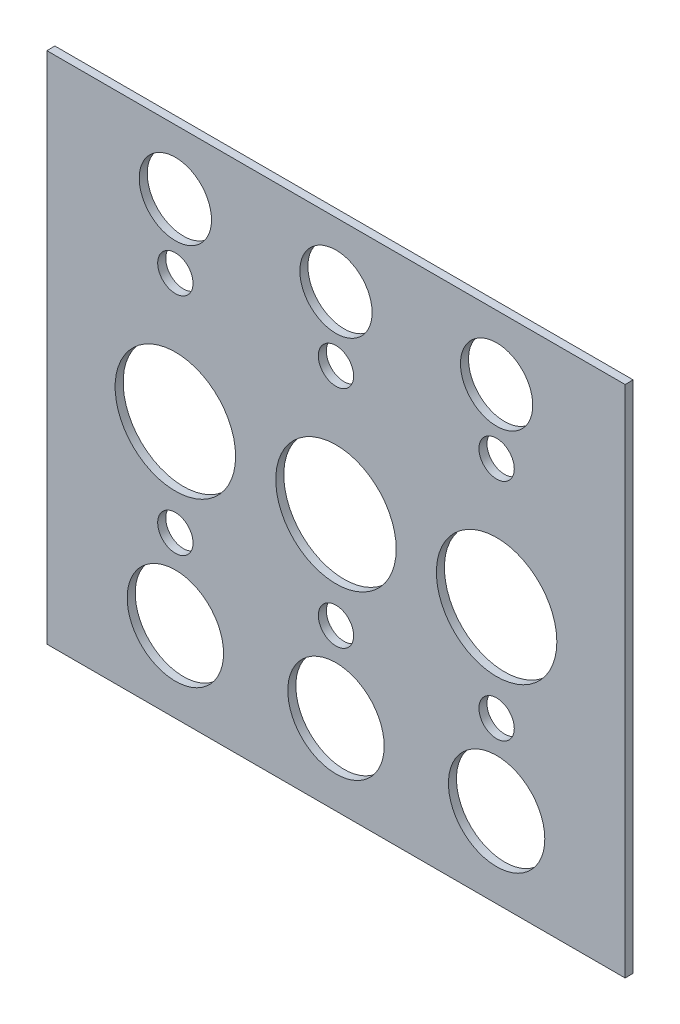
ISO-10303-21;
HEADER;
FILE_DESCRIPTION(('STEP AP214'),'2;1');
FILE_NAME('part.step','',(''),(''),'','','');
FILE_SCHEMA(('AUTOMOTIVE_DESIGN { 1 0 10303 214 1 1 1 1 }'));
ENDSEC;
DATA;
#1=APPLICATION_CONTEXT('core data for automotive mechanical design processes');
#2=APPLICATION_PROTOCOL_DEFINITION('international standard','automotive_design',2000,#1);
#3=PRODUCT_CONTEXT('',#1,'mechanical');
#4=PRODUCT('Part','Part','',(#3));
#5=PRODUCT_RELATED_PRODUCT_CATEGORY('part','',(#4));
#6=PRODUCT_DEFINITION_FORMATION('','',#4);
#7=PRODUCT_DEFINITION_CONTEXT('part definition',#1,'design');
#8=PRODUCT_DEFINITION('design','',#6,#7);
#9=PRODUCT_DEFINITION_SHAPE('','',#8);
#10=(LENGTH_UNIT() NAMED_UNIT(*) SI_UNIT(.MILLI.,.METRE.));
#11=(NAMED_UNIT(*) PLANE_ANGLE_UNIT() SI_UNIT($,.RADIAN.));
#12=(NAMED_UNIT(*) SI_UNIT($,.STERADIAN.) SOLID_ANGLE_UNIT());
#13=UNCERTAINTY_MEASURE_WITH_UNIT(LENGTH_MEASURE(1.E-05),#10,'distance_accuracy_value','');
#14=(GEOMETRIC_REPRESENTATION_CONTEXT(3) GLOBAL_UNCERTAINTY_ASSIGNED_CONTEXT((#13)) GLOBAL_UNIT_ASSIGNED_CONTEXT((#10,
#11,#12)) REPRESENTATION_CONTEXT('',''));
#15=CARTESIAN_POINT('',(0.,0.,0.));
#16=DIRECTION('',(0.,0.,1.));
#17=DIRECTION('',(1.,0.,0.));
#18=AXIS2_PLACEMENT_3D('',#15,#16,#17);
#19=CARTESIAN_POINT('',(0.,0.,5.));
#20=DIRECTION('',(0.,0.,1.));
#21=DIRECTION('',(1.,0.,0.));
#22=AXIS2_PLACEMENT_3D('',#19,#20,#21);
#23=PLANE('',#22);
#24=CARTESIAN_POINT('',(0.,120.,5.));
#25=DIRECTION('',(0.,0.,1.));
#26=DIRECTION('',(1.,0.,0.));
#27=AXIS2_PLACEMENT_3D('',#24,#25,#26);
#28=CIRCLE('',#27,22.5);
#29=CARTESIAN_POINT('',(22.5,120.,5.));
#30=VERTEX_POINT('',#29);
#31=EDGE_CURVE('E188',#30,#30,#28,.T.);
#32=ORIENTED_EDGE('',*,*,#31,.F.);
#33=EDGE_LOOP('',(#32));
#34=FACE_BOUND('',#33,.T.);
#35=CARTESIAN_POINT('',(-99.9999999999999,-110.,5.));
#36=DIRECTION('',(0.,0.,1.));
#37=DIRECTION('',(1.,0.,0.));
#38=AXIS2_PLACEMENT_3D('',#35,#36,#37);
#39=CIRCLE('',#38,30.);
#40=CARTESIAN_POINT('',(-70.,-110.,5.));
#41=VERTEX_POINT('',#40);
#42=EDGE_CURVE('E176',#41,#41,#39,.T.);
#43=ORIENTED_EDGE('',*,*,#42,.F.);
#44=EDGE_LOOP('',(#43));
#45=FACE_BOUND('',#44,.T.);
#46=CARTESIAN_POINT('',(100.,-110.,5.));
#47=DIRECTION('',(0.,0.,1.));
#48=DIRECTION('',(1.,0.,0.));
#49=AXIS2_PLACEMENT_3D('',#46,#47,#48);
#50=CIRCLE('',#49,30.);
#51=CARTESIAN_POINT('',(130.,-110.,5.));
#52=VERTEX_POINT('',#51);
#53=EDGE_CURVE('E164',#52,#52,#50,.T.);
#54=ORIENTED_EDGE('',*,*,#53,.F.);
#55=EDGE_LOOP('',(#54));
#56=FACE_BOUND('',#55,.T.);
#57=CARTESIAN_POINT('',(0.,0.,5.));
#58=DIRECTION('',(0.,0.,1.));
#59=DIRECTION('',(1.,0.,0.));
#60=AXIS2_PLACEMENT_3D('',#57,#58,#59);
#61=CIRCLE('',#60,37.5);
#62=CARTESIAN_POINT('',(37.5,0.,5.));
#63=VERTEX_POINT('',#62);
#64=EDGE_CURVE('E152',#63,#63,#61,.T.);
#65=ORIENTED_EDGE('',*,*,#64,.F.);
#66=EDGE_LOOP('',(#65));
#67=FACE_BOUND('',#66,.T.);
#68=CARTESIAN_POINT('',(-99.9999999999999,-60.,5.));
#69=DIRECTION('',(0.,0.,1.));
#70=DIRECTION('',(1.,0.,0.));
#71=AXIS2_PLACEMENT_3D('',#68,#69,#70);
#72=CIRCLE('',#71,11.);
#73=CARTESIAN_POINT('',(-89.,-60.,5.));
#74=VERTEX_POINT('',#73);
#75=EDGE_CURVE('E140',#74,#74,#72,.T.);
#76=ORIENTED_EDGE('',*,*,#75,.F.);
#77=EDGE_LOOP('',(#76));
#78=FACE_BOUND('',#77,.T.);
#79=CARTESIAN_POINT('',(0.,-60.,5.));
#80=DIRECTION('',(0.,0.,1.));
#81=DIRECTION('',(1.,0.,0.));
#82=AXIS2_PLACEMENT_3D('',#79,#80,#81);
#83=CIRCLE('',#82,11.);
#84=CARTESIAN_POINT('',(11.0000000000001,-60.,5.));
#85=VERTEX_POINT('',#84);
#86=EDGE_CURVE('E128',#85,#85,#83,.T.);
#87=ORIENTED_EDGE('',*,*,#86,.F.);
#88=EDGE_LOOP('',(#87));
#89=FACE_BOUND('',#88,.T.);
#90=CARTESIAN_POINT('',(100.,80.,5.));
#91=DIRECTION('',(0.,0.,1.));
#92=DIRECTION('',(1.,0.,0.));
#93=AXIS2_PLACEMENT_3D('',#90,#91,#92);
#94=CIRCLE('',#93,11.);
#95=CARTESIAN_POINT('',(111.,80.,5.));
#96=VERTEX_POINT('',#95);
#97=EDGE_CURVE('E116',#96,#96,#94,.T.);
#98=ORIENTED_EDGE('',*,*,#97,.F.);
#99=EDGE_LOOP('',(#98));
#100=FACE_BOUND('',#99,.T.);
#101=DIRECTION('',(0.,1.,0.));
#102=VECTOR('',#101,1.);
#103=CARTESIAN_POINT('',(180.,160.,5.));
#104=LINE('',#103,#102);
#105=CARTESIAN_POINT('',(180.,-160.,5.));
#106=VERTEX_POINT('',#105);
#107=CARTESIAN_POINT('',(180.,160.,5.));
#108=VERTEX_POINT('',#107);
#109=EDGE_CURVE('E86',#106,#108,#104,.T.);
#110=ORIENTED_EDGE('',*,*,#109,.T.);
#111=DIRECTION('',(-1.,0.,0.));
#112=VECTOR('',#111,1.);
#113=CARTESIAN_POINT('',(-180.,160.,5.));
#114=LINE('',#113,#112);
#115=CARTESIAN_POINT('',(-180.,160.,5.));
#116=VERTEX_POINT('',#115);
#117=EDGE_CURVE('E81',#108,#116,#114,.T.);
#118=ORIENTED_EDGE('',*,*,#117,.T.);
#119=DIRECTION('',(0.,-1.,0.));
#120=VECTOR('',#119,1.);
#121=CARTESIAN_POINT('',(-180.,160.,5.));
#122=LINE('',#121,#120);
#123=CARTESIAN_POINT('',(-180.,-160.,5.));
#124=VERTEX_POINT('',#123);
#125=EDGE_CURVE('E84',#116,#124,#122,.T.);
#126=ORIENTED_EDGE('',*,*,#125,.T.);
#127=DIRECTION('',(1.,0.,0.));
#128=VECTOR('',#127,1.);
#129=CARTESIAN_POINT('',(-180.,-160.,5.));
#130=LINE('',#129,#128);
#131=EDGE_CURVE('E51',#124,#106,#130,.T.);
#132=ORIENTED_EDGE('',*,*,#131,.T.);
#133=EDGE_LOOP('',(#110,#118,#126,#132));
#134=FACE_BOUND('',#133,.T.);
#135=CARTESIAN_POINT('',(0.,80.,5.));
#136=DIRECTION('',(0.,0.,1.));
#137=DIRECTION('',(1.,0.,0.));
#138=AXIS2_PLACEMENT_3D('',#135,#136,#137);
#139=CIRCLE('',#138,11.);
#140=CARTESIAN_POINT('',(11.,80.,5.));
#141=VERTEX_POINT('',#140);
#142=EDGE_CURVE('E101',#141,#141,#139,.T.);
#143=ORIENTED_EDGE('',*,*,#142,.F.);
#144=EDGE_LOOP('',(#143));
#145=FACE_BOUND('',#144,.T.);
#146=CARTESIAN_POINT('',(-100.,80.,5.));
#147=DIRECTION('',(0.,0.,1.));
#148=DIRECTION('',(1.,0.,0.));
#149=AXIS2_PLACEMENT_3D('',#146,#147,#148);
#150=CIRCLE('',#149,11.);
#151=CARTESIAN_POINT('',(-89.,80.,5.));
#152=VERTEX_POINT('',#151);
#153=EDGE_CURVE('E122',#152,#152,#150,.T.);
#154=ORIENTED_EDGE('',*,*,#153,.F.);
#155=EDGE_LOOP('',(#154));
#156=FACE_BOUND('',#155,.T.);
#157=CARTESIAN_POINT('',(100.,-60.,5.));
#158=DIRECTION('',(0.,0.,1.));
#159=DIRECTION('',(1.,0.,0.));
#160=AXIS2_PLACEMENT_3D('',#157,#158,#159);
#161=CIRCLE('',#160,11.);
#162=CARTESIAN_POINT('',(111.,-60.,5.));
#163=VERTEX_POINT('',#162);
#164=EDGE_CURVE('E134',#163,#163,#161,.T.);
#165=ORIENTED_EDGE('',*,*,#164,.F.);
#166=EDGE_LOOP('',(#165));
#167=FACE_BOUND('',#166,.T.);
#168=CARTESIAN_POINT('',(-100.,0.,5.));
#169=DIRECTION('',(0.,0.,1.));
#170=DIRECTION('',(1.,0.,0.));
#171=AXIS2_PLACEMENT_3D('',#168,#169,#170);
#172=CIRCLE('',#171,37.5);
#173=CARTESIAN_POINT('',(-62.5,0.,5.));
#174=VERTEX_POINT('',#173);
#175=EDGE_CURVE('E146',#174,#174,#172,.T.);
#176=ORIENTED_EDGE('',*,*,#175,.F.);
#177=EDGE_LOOP('',(#176));
#178=FACE_BOUND('',#177,.T.);
#179=CARTESIAN_POINT('',(100.,0.,5.));
#180=DIRECTION('',(0.,0.,1.));
#181=DIRECTION('',(1.,0.,0.));
#182=AXIS2_PLACEMENT_3D('',#179,#180,#181);
#183=CIRCLE('',#182,37.5);
#184=CARTESIAN_POINT('',(137.5,0.,5.));
#185=VERTEX_POINT('',#184);
#186=EDGE_CURVE('E158',#185,#185,#183,.T.);
#187=ORIENTED_EDGE('',*,*,#186,.F.);
#188=EDGE_LOOP('',(#187));
#189=FACE_BOUND('',#188,.T.);
#190=CARTESIAN_POINT('',(0.,-110.,5.));
#191=DIRECTION('',(0.,0.,1.));
#192=DIRECTION('',(1.,0.,0.));
#193=AXIS2_PLACEMENT_3D('',#190,#191,#192);
#194=CIRCLE('',#193,30.);
#195=CARTESIAN_POINT('',(30.,-110.,5.));
#196=VERTEX_POINT('',#195);
#197=EDGE_CURVE('E170',#196,#196,#194,.T.);
#198=ORIENTED_EDGE('',*,*,#197,.F.);
#199=EDGE_LOOP('',(#198));
#200=FACE_BOUND('',#199,.T.);
#201=CARTESIAN_POINT('',(-100.,120.,5.));
#202=DIRECTION('',(0.,0.,1.));
#203=DIRECTION('',(1.,0.,0.));
#204=AXIS2_PLACEMENT_3D('',#201,#202,#203);
#205=CIRCLE('',#204,22.4999999999999);
#206=CARTESIAN_POINT('',(-77.5,120.,5.));
#207=VERTEX_POINT('',#206);
#208=EDGE_CURVE('E182',#207,#207,#205,.T.);
#209=ORIENTED_EDGE('',*,*,#208,.F.);
#210=EDGE_LOOP('',(#209));
#211=FACE_BOUND('',#210,.T.);
#212=CARTESIAN_POINT('',(100.,120.,5.));
#213=DIRECTION('',(0.,0.,1.));
#214=DIRECTION('',(1.,0.,0.));
#215=AXIS2_PLACEMENT_3D('',#212,#213,#214);
#216=CIRCLE('',#215,22.5);
#217=CARTESIAN_POINT('',(122.5,120.,5.));
#218=VERTEX_POINT('',#217);
#219=EDGE_CURVE('E194',#218,#218,#216,.T.);
#220=ORIENTED_EDGE('',*,*,#219,.F.);
#221=EDGE_LOOP('',(#220));
#222=FACE_BOUND('',#221,.T.);
#223=ADVANCED_FACE('F34',(#34,#45,#56,#67,#78,#89,#100,#134,#145,#156,#167,#178,#189,#200,#211,
#222),#23,.T.);
#224=CARTESIAN_POINT('',(0.,0.,0.));
#225=DIRECTION('',(0.,0.,1.));
#226=DIRECTION('',(1.,0.,0.));
#227=AXIS2_PLACEMENT_3D('',#224,#225,#226);
#228=PLANE('',#227);
#229=DIRECTION('',(0.,1.,0.));
#230=VECTOR('',#229,1.);
#231=CARTESIAN_POINT('',(180.,160.,0.));
#232=LINE('',#231,#230);
#233=CARTESIAN_POINT('',(180.,-160.,0.));
#234=VERTEX_POINT('',#233);
#235=CARTESIAN_POINT('',(180.,160.,0.));
#236=VERTEX_POINT('',#235);
#237=EDGE_CURVE('E98',#234,#236,#232,.T.);
#238=ORIENTED_EDGE('',*,*,#237,.F.);
#239=DIRECTION('',(1.,0.,0.));
#240=VECTOR('',#239,1.);
#241=CARTESIAN_POINT('',(-180.,-160.,0.));
#242=LINE('',#241,#240);
#243=CARTESIAN_POINT('',(-180.,-160.,0.));
#244=VERTEX_POINT('',#243);
#245=EDGE_CURVE('E74',#244,#234,#242,.T.);
#246=ORIENTED_EDGE('',*,*,#245,.F.);
#247=DIRECTION('',(0.,-1.,0.));
#248=VECTOR('',#247,1.);
#249=CARTESIAN_POINT('',(-180.,160.,0.));
#250=LINE('',#249,#248);
#251=CARTESIAN_POINT('',(-180.,160.,0.));
#252=VERTEX_POINT('',#251);
#253=EDGE_CURVE('E68',#252,#244,#250,.T.);
#254=ORIENTED_EDGE('',*,*,#253,.F.);
#255=DIRECTION('',(-1.,0.,0.));
#256=VECTOR('',#255,1.);
#257=CARTESIAN_POINT('',(-180.,160.,0.));
#258=LINE('',#257,#256);
#259=EDGE_CURVE('E90',#236,#252,#258,.T.);
#260=ORIENTED_EDGE('',*,*,#259,.F.);
#261=EDGE_LOOP('',(#238,#246,#254,#260));
#262=FACE_BOUND('',#261,.T.);
#263=CARTESIAN_POINT('',(0.,80.,0.));
#264=DIRECTION('',(0.,0.,1.));
#265=DIRECTION('',(1.,0.,0.));
#266=AXIS2_PLACEMENT_3D('',#263,#264,#265);
#267=CIRCLE('',#266,11.);
#268=CARTESIAN_POINT('',(11.,80.,0.));
#269=VERTEX_POINT('',#268);
#270=EDGE_CURVE('E113',#269,#269,#267,.T.);
#271=ORIENTED_EDGE('',*,*,#270,.T.);
#272=EDGE_LOOP('',(#271));
#273=FACE_BOUND('',#272,.T.);
#274=CARTESIAN_POINT('',(100.,80.,0.));
#275=DIRECTION('',(0.,0.,1.));
#276=DIRECTION('',(1.,0.,0.));
#277=AXIS2_PLACEMENT_3D('',#274,#275,#276);
#278=CIRCLE('',#277,11.);
#279=CARTESIAN_POINT('',(111.,80.,0.));
#280=VERTEX_POINT('',#279);
#281=EDGE_CURVE('E119',#280,#280,#278,.T.);
#282=ORIENTED_EDGE('',*,*,#281,.T.);
#283=EDGE_LOOP('',(#282));
#284=FACE_BOUND('',#283,.T.);
#285=CARTESIAN_POINT('',(-100.,80.,0.));
#286=DIRECTION('',(0.,0.,1.));
#287=DIRECTION('',(1.,0.,0.));
#288=AXIS2_PLACEMENT_3D('',#285,#286,#287);
#289=CIRCLE('',#288,11.);
#290=CARTESIAN_POINT('',(-89.,80.,0.));
#291=VERTEX_POINT('',#290);
#292=EDGE_CURVE('E125',#291,#291,#289,.T.);
#293=ORIENTED_EDGE('',*,*,#292,.T.);
#294=EDGE_LOOP('',(#293));
#295=FACE_BOUND('',#294,.T.);
#296=CARTESIAN_POINT('',(0.,-60.,0.));
#297=DIRECTION('',(0.,0.,1.));
#298=DIRECTION('',(1.,0.,0.));
#299=AXIS2_PLACEMENT_3D('',#296,#297,#298);
#300=CIRCLE('',#299,11.);
#301=CARTESIAN_POINT('',(11.0000000000001,-60.,0.));
#302=VERTEX_POINT('',#301);
#303=EDGE_CURVE('E131',#302,#302,#300,.T.);
#304=ORIENTED_EDGE('',*,*,#303,.T.);
#305=EDGE_LOOP('',(#304));
#306=FACE_BOUND('',#305,.T.);
#307=CARTESIAN_POINT('',(100.,-60.,0.));
#308=DIRECTION('',(0.,0.,1.));
#309=DIRECTION('',(1.,0.,0.));
#310=AXIS2_PLACEMENT_3D('',#307,#308,#309);
#311=CIRCLE('',#310,11.);
#312=CARTESIAN_POINT('',(111.,-60.,0.));
#313=VERTEX_POINT('',#312);
#314=EDGE_CURVE('E137',#313,#313,#311,.T.);
#315=ORIENTED_EDGE('',*,*,#314,.T.);
#316=EDGE_LOOP('',(#315));
#317=FACE_BOUND('',#316,.T.);
#318=CARTESIAN_POINT('',(-99.9999999999999,-60.,0.));
#319=DIRECTION('',(0.,0.,1.));
#320=DIRECTION('',(1.,0.,0.));
#321=AXIS2_PLACEMENT_3D('',#318,#319,#320);
#322=CIRCLE('',#321,11.);
#323=CARTESIAN_POINT('',(-89.,-60.,0.));
#324=VERTEX_POINT('',#323);
#325=EDGE_CURVE('E143',#324,#324,#322,.T.);
#326=ORIENTED_EDGE('',*,*,#325,.T.);
#327=EDGE_LOOP('',(#326));
#328=FACE_BOUND('',#327,.T.);
#329=CARTESIAN_POINT('',(-100.,0.,0.));
#330=DIRECTION('',(0.,0.,1.));
#331=DIRECTION('',(1.,0.,0.));
#332=AXIS2_PLACEMENT_3D('',#329,#330,#331);
#333=CIRCLE('',#332,37.5);
#334=CARTESIAN_POINT('',(-62.5,0.,0.));
#335=VERTEX_POINT('',#334);
#336=EDGE_CURVE('E149',#335,#335,#333,.T.);
#337=ORIENTED_EDGE('',*,*,#336,.T.);
#338=EDGE_LOOP('',(#337));
#339=FACE_BOUND('',#338,.T.);
#340=CARTESIAN_POINT('',(0.,0.,0.));
#341=DIRECTION('',(0.,0.,1.));
#342=DIRECTION('',(1.,0.,0.));
#343=AXIS2_PLACEMENT_3D('',#340,#341,#342);
#344=CIRCLE('',#343,37.5);
#345=CARTESIAN_POINT('',(37.5,0.,0.));
#346=VERTEX_POINT('',#345);
#347=EDGE_CURVE('E155',#346,#346,#344,.T.);
#348=ORIENTED_EDGE('',*,*,#347,.T.);
#349=EDGE_LOOP('',(#348));
#350=FACE_BOUND('',#349,.T.);
#351=CARTESIAN_POINT('',(100.,0.,0.));
#352=DIRECTION('',(0.,0.,1.));
#353=DIRECTION('',(1.,0.,0.));
#354=AXIS2_PLACEMENT_3D('',#351,#352,#353);
#355=CIRCLE('',#354,37.5);
#356=CARTESIAN_POINT('',(137.5,0.,0.));
#357=VERTEX_POINT('',#356);
#358=EDGE_CURVE('E161',#357,#357,#355,.T.);
#359=ORIENTED_EDGE('',*,*,#358,.T.);
#360=EDGE_LOOP('',(#359));
#361=FACE_BOUND('',#360,.T.);
#362=CARTESIAN_POINT('',(100.,-110.,0.));
#363=DIRECTION('',(0.,0.,1.));
#364=DIRECTION('',(1.,0.,0.));
#365=AXIS2_PLACEMENT_3D('',#362,#363,#364);
#366=CIRCLE('',#365,30.);
#367=CARTESIAN_POINT('',(130.,-110.,0.));
#368=VERTEX_POINT('',#367);
#369=EDGE_CURVE('E167',#368,#368,#366,.T.);
#370=ORIENTED_EDGE('',*,*,#369,.T.);
#371=EDGE_LOOP('',(#370));
#372=FACE_BOUND('',#371,.T.);
#373=CARTESIAN_POINT('',(0.,-110.,0.));
#374=DIRECTION('',(0.,0.,1.));
#375=DIRECTION('',(1.,0.,0.));
#376=AXIS2_PLACEMENT_3D('',#373,#374,#375);
#377=CIRCLE('',#376,30.);
#378=CARTESIAN_POINT('',(30.,-110.,0.));
#379=VERTEX_POINT('',#378);
#380=EDGE_CURVE('E173',#379,#379,#377,.T.);
#381=ORIENTED_EDGE('',*,*,#380,.T.);
#382=EDGE_LOOP('',(#381));
#383=FACE_BOUND('',#382,.T.);
#384=CARTESIAN_POINT('',(-99.9999999999999,-110.,0.));
#385=DIRECTION('',(0.,0.,1.));
#386=DIRECTION('',(1.,0.,0.));
#387=AXIS2_PLACEMENT_3D('',#384,#385,#386);
#388=CIRCLE('',#387,30.);
#389=CARTESIAN_POINT('',(-70.,-110.,0.));
#390=VERTEX_POINT('',#389);
#391=EDGE_CURVE('E179',#390,#390,#388,.T.);
#392=ORIENTED_EDGE('',*,*,#391,.T.);
#393=EDGE_LOOP('',(#392));
#394=FACE_BOUND('',#393,.T.);
#395=CARTESIAN_POINT('',(-100.,120.,0.));
#396=DIRECTION('',(0.,0.,1.));
#397=DIRECTION('',(1.,0.,0.));
#398=AXIS2_PLACEMENT_3D('',#395,#396,#397);
#399=CIRCLE('',#398,22.4999999999999);
#400=CARTESIAN_POINT('',(-77.5,120.,0.));
#401=VERTEX_POINT('',#400);
#402=EDGE_CURVE('E185',#401,#401,#399,.T.);
#403=ORIENTED_EDGE('',*,*,#402,.T.);
#404=EDGE_LOOP('',(#403));
#405=FACE_BOUND('',#404,.T.);
#406=CARTESIAN_POINT('',(0.,120.,0.));
#407=DIRECTION('',(0.,0.,1.));
#408=DIRECTION('',(1.,0.,0.));
#409=AXIS2_PLACEMENT_3D('',#406,#407,#408);
#410=CIRCLE('',#409,22.5);
#411=CARTESIAN_POINT('',(22.5,120.,0.));
#412=VERTEX_POINT('',#411);
#413=EDGE_CURVE('E191',#412,#412,#410,.T.);
#414=ORIENTED_EDGE('',*,*,#413,.T.);
#415=EDGE_LOOP('',(#414));
#416=FACE_BOUND('',#415,.T.);
#417=CARTESIAN_POINT('',(100.,120.,0.));
#418=DIRECTION('',(0.,0.,1.));
#419=DIRECTION('',(1.,0.,0.));
#420=AXIS2_PLACEMENT_3D('',#417,#418,#419);
#421=CIRCLE('',#420,22.5);
#422=CARTESIAN_POINT('',(122.5,120.,0.));
#423=VERTEX_POINT('',#422);
#424=EDGE_CURVE('E197',#423,#423,#421,.T.);
#425=ORIENTED_EDGE('',*,*,#424,.T.);
#426=EDGE_LOOP('',(#425));
#427=FACE_BOUND('',#426,.T.);
#428=ADVANCED_FACE('F109',(#262,#273,#284,#295,#306,#317,#328,#339,#350,#361,#372,#383,#394,
#405,#416,#427),#228,.F.);
#429=CARTESIAN_POINT('',(180.,160.,5.));
#430=DIRECTION('',(-1.,0.,0.));
#431=DIRECTION('',(0.,-1.,0.));
#432=AXIS2_PLACEMENT_3D('',#429,#430,#431);
#433=PLANE('',#432);
#434=ORIENTED_EDGE('',*,*,#237,.T.);
#435=DIRECTION('',(0.,0.,-1.));
#436=VECTOR('',#435,1.);
#437=CARTESIAN_POINT('',(180.,160.,5.));
#438=LINE('',#437,#436);
#439=EDGE_CURVE('E11',#108,#236,#438,.T.);
#440=ORIENTED_EDGE('',*,*,#439,.F.);
#441=ORIENTED_EDGE('',*,*,#109,.F.);
#442=DIRECTION('',(0.,0.,-1.));
#443=VECTOR('',#442,1.);
#444=CARTESIAN_POINT('',(180.,-160.,5.));
#445=LINE('',#444,#443);
#446=EDGE_CURVE('E94',#106,#234,#445,.T.);
#447=ORIENTED_EDGE('',*,*,#446,.T.);
#448=EDGE_LOOP('',(#434,#440,#441,#447));
#449=FACE_BOUND('',#448,.T.);
#450=ADVANCED_FACE('F36',(#449),#433,.F.);
#451=CARTESIAN_POINT('',(-180.,160.,5.));
#452=DIRECTION('',(0.,-1.,0.));
#453=DIRECTION('',(0.,0.,-1.));
#454=AXIS2_PLACEMENT_3D('',#451,#452,#453);
#455=PLANE('',#454);
#456=ORIENTED_EDGE('',*,*,#259,.T.);
#457=DIRECTION('',(0.,0.,-1.));
#458=VECTOR('',#457,1.);
#459=CARTESIAN_POINT('',(-180.,160.,5.));
#460=LINE('',#459,#458);
#461=EDGE_CURVE('E43',#116,#252,#460,.T.);
#462=ORIENTED_EDGE('',*,*,#461,.F.);
#463=ORIENTED_EDGE('',*,*,#117,.F.);
#464=ORIENTED_EDGE('',*,*,#439,.T.);
#465=EDGE_LOOP('',(#456,#462,#463,#464));
#466=FACE_BOUND('',#465,.T.);
#467=ADVANCED_FACE('F89',(#466),#455,.F.);
#468=CARTESIAN_POINT('',(-180.,160.,5.));
#469=DIRECTION('',(1.,0.,0.));
#470=DIRECTION('',(0.,1.,0.));
#471=AXIS2_PLACEMENT_3D('',#468,#469,#470);
#472=PLANE('',#471);
#473=ORIENTED_EDGE('',*,*,#253,.T.);
#474=DIRECTION('',(0.,0.,-1.));
#475=VECTOR('',#474,1.);
#476=CARTESIAN_POINT('',(-180.,-160.,5.));
#477=LINE('',#476,#475);
#478=EDGE_CURVE('E91',#124,#244,#477,.T.);
#479=ORIENTED_EDGE('',*,*,#478,.F.);
#480=ORIENTED_EDGE('',*,*,#125,.F.);
#481=ORIENTED_EDGE('',*,*,#461,.T.);
#482=EDGE_LOOP('',(#473,#479,#480,#481));
#483=FACE_BOUND('',#482,.T.);
#484=ADVANCED_FACE('F92',(#483),#472,.F.);
#485=CARTESIAN_POINT('',(-180.,-160.,5.));
#486=DIRECTION('',(0.,1.,0.));
#487=DIRECTION('',(0.,0.,1.));
#488=AXIS2_PLACEMENT_3D('',#485,#486,#487);
#489=PLANE('',#488);
#490=ORIENTED_EDGE('',*,*,#245,.T.);
#491=ORIENTED_EDGE('',*,*,#446,.F.);
#492=ORIENTED_EDGE('',*,*,#131,.F.);
#493=ORIENTED_EDGE('',*,*,#478,.T.);
#494=EDGE_LOOP('',(#490,#491,#492,#493));
#495=FACE_BOUND('',#494,.T.);
#496=ADVANCED_FACE('F106',(#495),#489,.F.);
#497=CARTESIAN_POINT('',(0.,80.,5.));
#498=DIRECTION('',(0.,0.,-1.));
#499=DIRECTION('',(-1.,0.,0.));
#500=AXIS2_PLACEMENT_3D('',#497,#498,#499);
#501=CYLINDRICAL_SURFACE('',#500,11.);
#502=ORIENTED_EDGE('',*,*,#142,.T.);
#503=EDGE_LOOP('',(#502));
#504=FACE_BOUND('',#503,.T.);
#505=ORIENTED_EDGE('',*,*,#270,.F.);
#506=EDGE_LOOP('',(#505));
#507=FACE_BOUND('',#506,.T.);
#508=ADVANCED_FACE('F216',(#504,#507),#501,.F.);
#509=CARTESIAN_POINT('',(100.,80.,5.));
#510=DIRECTION('',(0.,0.,-1.));
#511=DIRECTION('',(-1.,0.,0.));
#512=AXIS2_PLACEMENT_3D('',#509,#510,#511);
#513=CYLINDRICAL_SURFACE('',#512,11.);
#514=ORIENTED_EDGE('',*,*,#97,.T.);
#515=EDGE_LOOP('',(#514));
#516=FACE_BOUND('',#515,.T.);
#517=ORIENTED_EDGE('',*,*,#281,.F.);
#518=EDGE_LOOP('',(#517));
#519=FACE_BOUND('',#518,.T.);
#520=ADVANCED_FACE('F262',(#516,#519),#513,.F.);
#521=CARTESIAN_POINT('',(-100.,80.,5.));
#522=DIRECTION('',(0.,0.,-1.));
#523=DIRECTION('',(-1.,0.,0.));
#524=AXIS2_PLACEMENT_3D('',#521,#522,#523);
#525=CYLINDRICAL_SURFACE('',#524,11.);
#526=ORIENTED_EDGE('',*,*,#153,.T.);
#527=EDGE_LOOP('',(#526));
#528=FACE_BOUND('',#527,.T.);
#529=ORIENTED_EDGE('',*,*,#292,.F.);
#530=EDGE_LOOP('',(#529));
#531=FACE_BOUND('',#530,.T.);
#532=ADVANCED_FACE('F270',(#528,#531),#525,.F.);
#533=CARTESIAN_POINT('',(0.,-60.,5.));
#534=DIRECTION('',(0.,0.,-1.));
#535=DIRECTION('',(-1.,0.,0.));
#536=AXIS2_PLACEMENT_3D('',#533,#534,#535);
#537=CYLINDRICAL_SURFACE('',#536,11.);
#538=ORIENTED_EDGE('',*,*,#86,.T.);
#539=EDGE_LOOP('',(#538));
#540=FACE_BOUND('',#539,.T.);
#541=ORIENTED_EDGE('',*,*,#303,.F.);
#542=EDGE_LOOP('',(#541));
#543=FACE_BOUND('',#542,.T.);
#544=ADVANCED_FACE('F278',(#540,#543),#537,.F.);
#545=CARTESIAN_POINT('',(100.,-60.,5.));
#546=DIRECTION('',(0.,0.,-1.));
#547=DIRECTION('',(-1.,0.,0.));
#548=AXIS2_PLACEMENT_3D('',#545,#546,#547);
#549=CYLINDRICAL_SURFACE('',#548,11.);
#550=ORIENTED_EDGE('',*,*,#164,.T.);
#551=EDGE_LOOP('',(#550));
#552=FACE_BOUND('',#551,.T.);
#553=ORIENTED_EDGE('',*,*,#314,.F.);
#554=EDGE_LOOP('',(#553));
#555=FACE_BOUND('',#554,.T.);
#556=ADVANCED_FACE('F287',(#552,#555),#549,.F.);
#557=CARTESIAN_POINT('',(-99.9999999999999,-60.,5.));
#558=DIRECTION('',(0.,0.,-1.));
#559=DIRECTION('',(-1.,0.,0.));
#560=AXIS2_PLACEMENT_3D('',#557,#558,#559);
#561=CYLINDRICAL_SURFACE('',#560,11.);
#562=ORIENTED_EDGE('',*,*,#75,.T.);
#563=EDGE_LOOP('',(#562));
#564=FACE_BOUND('',#563,.T.);
#565=ORIENTED_EDGE('',*,*,#325,.F.);
#566=EDGE_LOOP('',(#565));
#567=FACE_BOUND('',#566,.T.);
#568=ADVANCED_FACE('F296',(#564,#567),#561,.F.);
#569=CARTESIAN_POINT('',(-100.,0.,5.));
#570=DIRECTION('',(0.,0.,-1.));
#571=DIRECTION('',(-1.,0.,0.));
#572=AXIS2_PLACEMENT_3D('',#569,#570,#571);
#573=CYLINDRICAL_SURFACE('',#572,37.5);
#574=ORIENTED_EDGE('',*,*,#175,.T.);
#575=EDGE_LOOP('',(#574));
#576=FACE_BOUND('',#575,.T.);
#577=ORIENTED_EDGE('',*,*,#336,.F.);
#578=EDGE_LOOP('',(#577));
#579=FACE_BOUND('',#578,.T.);
#580=ADVANCED_FACE('F305',(#576,#579),#573,.F.);
#581=CARTESIAN_POINT('',(0.,0.,5.));
#582=DIRECTION('',(0.,0.,-1.));
#583=DIRECTION('',(-1.,0.,0.));
#584=AXIS2_PLACEMENT_3D('',#581,#582,#583);
#585=CYLINDRICAL_SURFACE('',#584,37.5);
#586=ORIENTED_EDGE('',*,*,#64,.T.);
#587=EDGE_LOOP('',(#586));
#588=FACE_BOUND('',#587,.T.);
#589=ORIENTED_EDGE('',*,*,#347,.F.);
#590=EDGE_LOOP('',(#589));
#591=FACE_BOUND('',#590,.T.);
#592=ADVANCED_FACE('F314',(#588,#591),#585,.F.);
#593=CARTESIAN_POINT('',(100.,0.,5.));
#594=DIRECTION('',(0.,0.,-1.));
#595=DIRECTION('',(-1.,0.,0.));
#596=AXIS2_PLACEMENT_3D('',#593,#594,#595);
#597=CYLINDRICAL_SURFACE('',#596,37.5);
#598=ORIENTED_EDGE('',*,*,#186,.T.);
#599=EDGE_LOOP('',(#598));
#600=FACE_BOUND('',#599,.T.);
#601=ORIENTED_EDGE('',*,*,#358,.F.);
#602=EDGE_LOOP('',(#601));
#603=FACE_BOUND('',#602,.T.);
#604=ADVANCED_FACE('F323',(#600,#603),#597,.F.);
#605=CARTESIAN_POINT('',(100.,-110.,5.));
#606=DIRECTION('',(0.,0.,-1.));
#607=DIRECTION('',(-1.,0.,0.));
#608=AXIS2_PLACEMENT_3D('',#605,#606,#607);
#609=CYLINDRICAL_SURFACE('',#608,30.);
#610=ORIENTED_EDGE('',*,*,#53,.T.);
#611=EDGE_LOOP('',(#610));
#612=FACE_BOUND('',#611,.T.);
#613=ORIENTED_EDGE('',*,*,#369,.F.);
#614=EDGE_LOOP('',(#613));
#615=FACE_BOUND('',#614,.T.);
#616=ADVANCED_FACE('F332',(#612,#615),#609,.F.);
#617=CARTESIAN_POINT('',(0.,-110.,5.));
#618=DIRECTION('',(0.,0.,-1.));
#619=DIRECTION('',(-1.,0.,0.));
#620=AXIS2_PLACEMENT_3D('',#617,#618,#619);
#621=CYLINDRICAL_SURFACE('',#620,30.);
#622=ORIENTED_EDGE('',*,*,#197,.T.);
#623=EDGE_LOOP('',(#622));
#624=FACE_BOUND('',#623,.T.);
#625=ORIENTED_EDGE('',*,*,#380,.F.);
#626=EDGE_LOOP('',(#625));
#627=FACE_BOUND('',#626,.T.);
#628=ADVANCED_FACE('F341',(#624,#627),#621,.F.);
#629=CARTESIAN_POINT('',(-99.9999999999999,-110.,5.));
#630=DIRECTION('',(0.,0.,-1.));
#631=DIRECTION('',(-1.,0.,0.));
#632=AXIS2_PLACEMENT_3D('',#629,#630,#631);
#633=CYLINDRICAL_SURFACE('',#632,30.);
#634=ORIENTED_EDGE('',*,*,#42,.T.);
#635=EDGE_LOOP('',(#634));
#636=FACE_BOUND('',#635,.T.);
#637=ORIENTED_EDGE('',*,*,#391,.F.);
#638=EDGE_LOOP('',(#637));
#639=FACE_BOUND('',#638,.T.);
#640=ADVANCED_FACE('F350',(#636,#639),#633,.F.);
#641=CARTESIAN_POINT('',(-100.,120.,5.));
#642=DIRECTION('',(0.,0.,-1.));
#643=DIRECTION('',(-1.,0.,0.));
#644=AXIS2_PLACEMENT_3D('',#641,#642,#643);
#645=CYLINDRICAL_SURFACE('',#644,22.4999999999999);
#646=ORIENTED_EDGE('',*,*,#208,.T.);
#647=EDGE_LOOP('',(#646));
#648=FACE_BOUND('',#647,.T.);
#649=ORIENTED_EDGE('',*,*,#402,.F.);
#650=EDGE_LOOP('',(#649));
#651=FACE_BOUND('',#650,.T.);
#652=ADVANCED_FACE('F359',(#648,#651),#645,.F.);
#653=CARTESIAN_POINT('',(0.,120.,5.));
#654=DIRECTION('',(0.,0.,-1.));
#655=DIRECTION('',(-1.,0.,0.));
#656=AXIS2_PLACEMENT_3D('',#653,#654,#655);
#657=CYLINDRICAL_SURFACE('',#656,22.5);
#658=ORIENTED_EDGE('',*,*,#31,.T.);
#659=EDGE_LOOP('',(#658));
#660=FACE_BOUND('',#659,.T.);
#661=ORIENTED_EDGE('',*,*,#413,.F.);
#662=EDGE_LOOP('',(#661));
#663=FACE_BOUND('',#662,.T.);
#664=ADVANCED_FACE('F368',(#660,#663),#657,.F.);
#665=CARTESIAN_POINT('',(100.,120.,5.));
#666=DIRECTION('',(0.,0.,-1.));
#667=DIRECTION('',(-1.,0.,0.));
#668=AXIS2_PLACEMENT_3D('',#665,#666,#667);
#669=CYLINDRICAL_SURFACE('',#668,22.5);
#670=ORIENTED_EDGE('',*,*,#219,.T.);
#671=EDGE_LOOP('',(#670));
#672=FACE_BOUND('',#671,.T.);
#673=ORIENTED_EDGE('',*,*,#424,.F.);
#674=EDGE_LOOP('',(#673));
#675=FACE_BOUND('',#674,.T.);
#676=ADVANCED_FACE('F203',(#672,#675),#669,.F.);
#677=CLOSED_SHELL('',(#223,#428,#450,#467,#484,#496,#508,#520,#532,#544,#556,#568,#580,#592,
#604,#616,#628,#640,#652,#664,#676));
#678=MANIFOLD_SOLID_BREP('B2',#677);
#679=ADVANCED_BREP_SHAPE_REPRESENTATION('',(#18,#678),#14);
#680=SHAPE_DEFINITION_REPRESENTATION(#9,#679);
ENDSEC;
END-ISO-10303-21;
